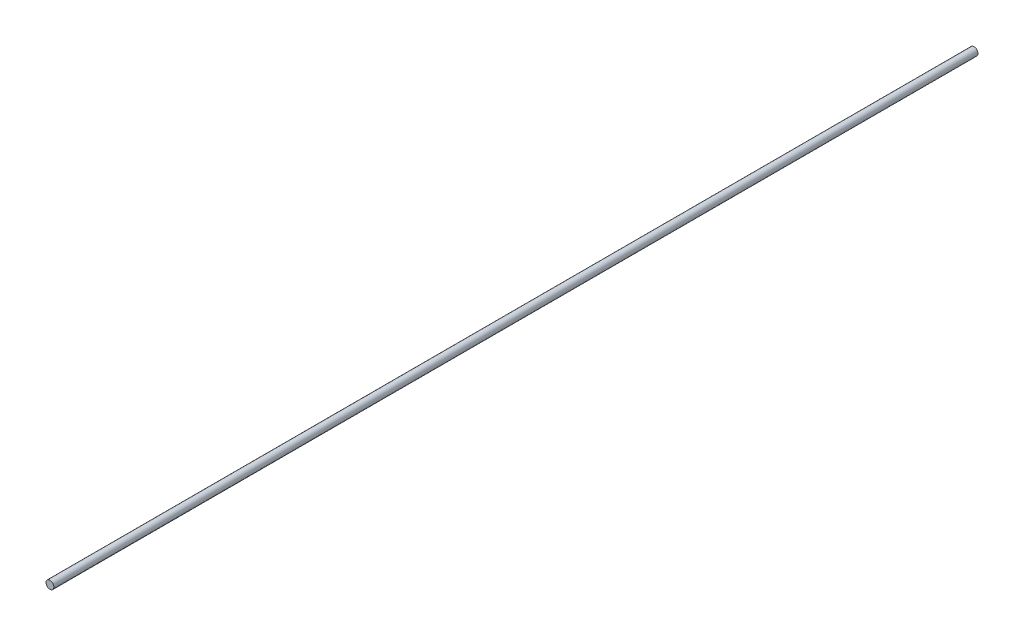
ISO-10303-21;
HEADER;
FILE_DESCRIPTION(('STEP AP214'),'2;1');
FILE_NAME('part.step','',(''),(''),'','','');
FILE_SCHEMA(('AUTOMOTIVE_DESIGN { 1 0 10303 214 1 1 1 1 }'));
ENDSEC;
DATA;
#1=APPLICATION_CONTEXT('core data for automotive mechanical design processes');
#2=APPLICATION_PROTOCOL_DEFINITION('international standard','automotive_design',2000,#1);
#3=PRODUCT_CONTEXT('',#1,'mechanical');
#4=PRODUCT('Part','Part','',(#3));
#5=PRODUCT_RELATED_PRODUCT_CATEGORY('part','',(#4));
#6=PRODUCT_DEFINITION_FORMATION('','',#4);
#7=PRODUCT_DEFINITION_CONTEXT('part definition',#1,'design');
#8=PRODUCT_DEFINITION('design','',#6,#7);
#9=PRODUCT_DEFINITION_SHAPE('','',#8);
#10=(LENGTH_UNIT() NAMED_UNIT(*) SI_UNIT(.MILLI.,.METRE.));
#11=(NAMED_UNIT(*) PLANE_ANGLE_UNIT() SI_UNIT($,.RADIAN.));
#12=(NAMED_UNIT(*) SI_UNIT($,.STERADIAN.) SOLID_ANGLE_UNIT());
#13=UNCERTAINTY_MEASURE_WITH_UNIT(LENGTH_MEASURE(1.E-05),#10,'distance_accuracy_value','');
#14=(GEOMETRIC_REPRESENTATION_CONTEXT(3) GLOBAL_UNCERTAINTY_ASSIGNED_CONTEXT((#13)) GLOBAL_UNIT_ASSIGNED_CONTEXT((#10,
#11,#12)) REPRESENTATION_CONTEXT('',''));
#15=CARTESIAN_POINT('',(0.,0.,0.));
#16=DIRECTION('',(0.,0.,1.));
#17=DIRECTION('',(1.,0.,0.));
#18=AXIS2_PLACEMENT_3D('',#15,#16,#17);
#19=CARTESIAN_POINT('',(0.,0.,1491.234));
#20=DIRECTION('',(0.,0.,-1.));
#21=DIRECTION('',(-1.,0.,0.));
#22=AXIS2_PLACEMENT_3D('',#19,#20,#21);
#23=CYLINDRICAL_SURFACE('',#22,6.35);
#24=CARTESIAN_POINT('',(0.,0.,1491.234));
#25=DIRECTION('',(0.,0.,1.));
#26=DIRECTION('',(1.,0.,0.));
#27=AXIS2_PLACEMENT_3D('',#24,#25,#26);
#28=CIRCLE('',#27,6.35);
#29=CARTESIAN_POINT('',(6.35,0.,1491.234));
#30=VERTEX_POINT('',#29);
#31=EDGE_CURVE('E11',#30,#30,#28,.T.);
#32=ORIENTED_EDGE('',*,*,#31,.F.);
#33=EDGE_LOOP('',(#32));
#34=FACE_BOUND('',#33,.T.);
#35=CARTESIAN_POINT('',(0.,0.,0.));
#36=DIRECTION('',(0.,0.,1.));
#37=DIRECTION('',(1.,0.,0.));
#38=AXIS2_PLACEMENT_3D('',#35,#36,#37);
#39=CIRCLE('',#38,6.35);
#40=CARTESIAN_POINT('',(6.35,0.,0.));
#41=VERTEX_POINT('',#40);
#42=EDGE_CURVE('E51',#41,#41,#39,.T.);
#43=ORIENTED_EDGE('',*,*,#42,.T.);
#44=EDGE_LOOP('',(#43));
#45=FACE_BOUND('',#44,.T.);
#46=ADVANCED_FACE('F48',(#34,#45),#23,.T.);
#47=CARTESIAN_POINT('',(0.,0.,1491.234));
#48=DIRECTION('',(0.,0.,1.));
#49=DIRECTION('',(1.,0.,0.));
#50=AXIS2_PLACEMENT_3D('',#47,#48,#49);
#51=PLANE('',#50);
#52=ORIENTED_EDGE('',*,*,#31,.T.);
#53=EDGE_LOOP('',(#52));
#54=FACE_BOUND('',#53,.T.);
#55=ADVANCED_FACE('F67',(#54),#51,.T.);
#56=CARTESIAN_POINT('',(0.,0.,0.));
#57=DIRECTION('',(0.,0.,1.));
#58=DIRECTION('',(1.,0.,0.));
#59=AXIS2_PLACEMENT_3D('',#56,#57,#58);
#60=PLANE('',#59);
#61=ORIENTED_EDGE('',*,*,#42,.F.);
#62=EDGE_LOOP('',(#61));
#63=FACE_BOUND('',#62,.T.);
#64=ADVANCED_FACE('F63',(#63),#60,.F.);
#65=CLOSED_SHELL('',(#46,#55,#64));
#66=MANIFOLD_SOLID_BREP('B2',#65);
#67=ADVANCED_BREP_SHAPE_REPRESENTATION('',(#18,#66),#14);
#68=SHAPE_DEFINITION_REPRESENTATION(#9,#67);
ENDSEC;
END-ISO-10303-21;
